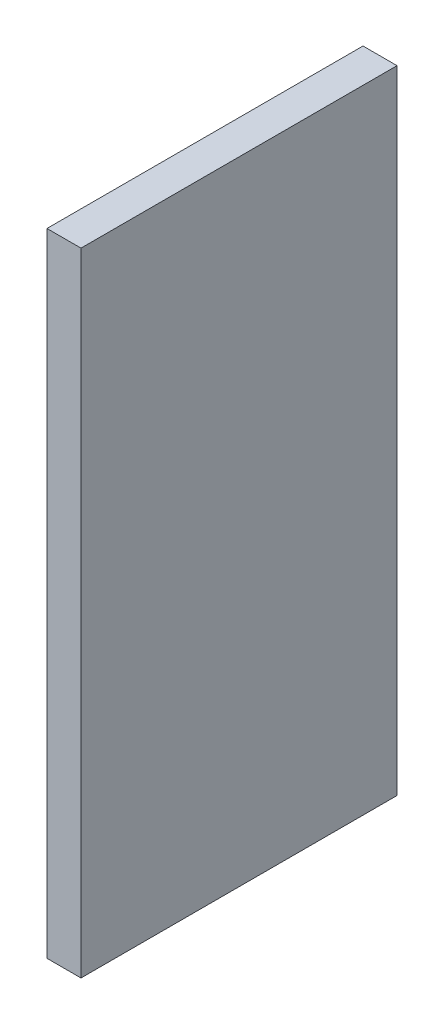
ISO-10303-21;
HEADER;
FILE_DESCRIPTION(('STEP AP214'),'2;1');
FILE_NAME('part.step','',(''),(''),'','','');
FILE_SCHEMA(('AUTOMOTIVE_DESIGN { 1 0 10303 214 1 1 1 1 }'));
ENDSEC;
DATA;
#1=APPLICATION_CONTEXT('core data for automotive mechanical design processes');
#2=APPLICATION_PROTOCOL_DEFINITION('international standard','automotive_design',2000,#1);
#3=PRODUCT_CONTEXT('',#1,'mechanical');
#4=PRODUCT('Part','Part','',(#3));
#5=PRODUCT_RELATED_PRODUCT_CATEGORY('part','',(#4));
#6=PRODUCT_DEFINITION_FORMATION('','',#4);
#7=PRODUCT_DEFINITION_CONTEXT('part definition',#1,'design');
#8=PRODUCT_DEFINITION('design','',#6,#7);
#9=PRODUCT_DEFINITION_SHAPE('','',#8);
#10=(LENGTH_UNIT() NAMED_UNIT(*) SI_UNIT(.MILLI.,.METRE.));
#11=(NAMED_UNIT(*) PLANE_ANGLE_UNIT() SI_UNIT($,.RADIAN.));
#12=(NAMED_UNIT(*) SI_UNIT($,.STERADIAN.) SOLID_ANGLE_UNIT());
#13=UNCERTAINTY_MEASURE_WITH_UNIT(LENGTH_MEASURE(1.E-05),#10,'distance_accuracy_value','');
#14=(GEOMETRIC_REPRESENTATION_CONTEXT(3) GLOBAL_UNCERTAINTY_ASSIGNED_CONTEXT((#13)) GLOBAL_UNIT_ASSIGNED_CONTEXT((#10,
#11,#12)) REPRESENTATION_CONTEXT('',''));
#15=CARTESIAN_POINT('',(0.,0.,0.));
#16=DIRECTION('',(0.,0.,1.));
#17=DIRECTION('',(1.,0.,0.));
#18=AXIS2_PLACEMENT_3D('',#15,#16,#17);
#19=CARTESIAN_POINT('',(102.034991679986,60.,-0.371420546364334));
#20=DIRECTION('',(1.,0.,0.));
#21=DIRECTION('',(0.,1.,0.));
#22=AXIS2_PLACEMENT_3D('',#19,#20,#21);
#23=PLANE('',#22);
#24=DIRECTION('',(0.,-1.,0.));
#25=VECTOR('',#24,1.);
#26=CARTESIAN_POINT('',(102.034991679986,60.,-0.371420546366252));
#27=LINE('',#26,#25);
#28=CARTESIAN_POINT('',(102.034991679986,125.,-0.371420546366252));
#29=VERTEX_POINT('',#28);
#30=CARTESIAN_POINT('',(102.034991679986,-5.,-0.371420546366252));
#31=VERTEX_POINT('',#30);
#32=EDGE_CURVE('E93',#29,#31,#27,.T.);
#33=ORIENTED_EDGE('',*,*,#32,.T.);
#34=DIRECTION('',(0.,0.,-1.));
#35=VECTOR('',#34,1.);
#36=CARTESIAN_POINT('',(102.034991679986,-5.,64.6285794536357));
#37=LINE('',#36,#35);
#38=CARTESIAN_POINT('',(102.034991679986,-5.,64.6285794536357));
#39=VERTEX_POINT('',#38);
#40=EDGE_CURVE('E87',#39,#31,#37,.T.);
#41=ORIENTED_EDGE('',*,*,#40,.F.);
#42=DIRECTION('',(0.,-1.,0.));
#43=VECTOR('',#42,1.);
#44=CARTESIAN_POINT('',(102.034991679986,125.,64.6285794536357));
#45=LINE('',#44,#43);
#46=CARTESIAN_POINT('',(102.034991679986,125.,64.6285794536357));
#47=VERTEX_POINT('',#46);
#48=EDGE_CURVE('E79',#47,#39,#45,.T.);
#49=ORIENTED_EDGE('',*,*,#48,.F.);
#50=DIRECTION('',(0.,0.,1.));
#51=VECTOR('',#50,1.);
#52=CARTESIAN_POINT('',(102.034991679986,125.,-65.3714205463643));
#53=LINE('',#52,#51);
#54=EDGE_CURVE('E11',#29,#47,#53,.T.);
#55=ORIENTED_EDGE('',*,*,#54,.F.);
#56=EDGE_LOOP('',(#33,#41,#49,#55));
#57=FACE_BOUND('',#56,.T.);
#58=ADVANCED_FACE('F17',(#57),#23,.F.);
#59=CARTESIAN_POINT('',(102.034991679986,125.,-65.3714205463643));
#60=DIRECTION('',(0.,1.,0.));
#61=DIRECTION('',(1.,0.,0.));
#62=AXIS2_PLACEMENT_3D('',#59,#60,#61);
#63=PLANE('',#62);
#64=DIRECTION('',(-1.,0.,0.));
#65=VECTOR('',#64,1.);
#66=CARTESIAN_POINT('',(103.784991679986,125.,-0.371420546366252));
#67=LINE('',#66,#65);
#68=CARTESIAN_POINT('',(109.034991679986,125.,-0.371420546366252));
#69=VERTEX_POINT('',#68);
#70=EDGE_CURVE('E107',#69,#29,#67,.T.);
#71=ORIENTED_EDGE('',*,*,#70,.T.);
#72=ORIENTED_EDGE('',*,*,#54,.T.);
#73=DIRECTION('',(1.,0.,0.));
#74=VECTOR('',#73,1.);
#75=CARTESIAN_POINT('',(102.034991679986,125.,64.6285794536357));
#76=LINE('',#75,#74);
#77=CARTESIAN_POINT('',(109.034991679986,125.,64.6285794536357));
#78=VERTEX_POINT('',#77);
#79=EDGE_CURVE('E27',#47,#78,#76,.T.);
#80=ORIENTED_EDGE('',*,*,#79,.T.);
#81=DIRECTION('',(0.,0.,1.));
#82=VECTOR('',#81,1.);
#83=CARTESIAN_POINT('',(109.034991679986,125.,-32.8714205463643));
#84=LINE('',#83,#82);
#85=EDGE_CURVE('E76',#69,#78,#84,.T.);
#86=ORIENTED_EDGE('',*,*,#85,.F.);
#87=EDGE_LOOP('',(#71,#72,#80,#86));
#88=FACE_BOUND('',#87,.T.);
#89=ADVANCED_FACE('F159',(#88),#63,.T.);
#90=CARTESIAN_POINT('',(102.034991679986,125.,64.6285794536357));
#91=DIRECTION('',(0.,0.,1.));
#92=DIRECTION('',(1.,0.,0.));
#93=AXIS2_PLACEMENT_3D('',#90,#91,#92);
#94=PLANE('',#93);
#95=ORIENTED_EDGE('',*,*,#48,.T.);
#96=DIRECTION('',(1.,0.,0.));
#97=VECTOR('',#96,1.);
#98=CARTESIAN_POINT('',(102.034991679986,-5.,64.6285794536357));
#99=LINE('',#98,#97);
#100=CARTESIAN_POINT('',(109.034991679986,-5.,64.6285794536357));
#101=VERTEX_POINT('',#100);
#102=EDGE_CURVE('E82',#39,#101,#99,.T.);
#103=ORIENTED_EDGE('',*,*,#102,.T.);
#104=DIRECTION('',(0.,-1.,0.));
#105=VECTOR('',#104,1.);
#106=CARTESIAN_POINT('',(109.034991679986,92.5,64.6285794536357));
#107=LINE('',#106,#105);
#108=EDGE_CURVE('E69',#78,#101,#107,.T.);
#109=ORIENTED_EDGE('',*,*,#108,.F.);
#110=ORIENTED_EDGE('',*,*,#79,.F.);
#111=EDGE_LOOP('',(#95,#103,#109,#110));
#112=FACE_BOUND('',#111,.T.);
#113=ADVANCED_FACE('F19',(#112),#94,.T.);
#114=CARTESIAN_POINT('',(109.034991679986,60.,-0.371420546364334));
#115=DIRECTION('',(1.,0.,0.));
#116=DIRECTION('',(0.,1.,0.));
#117=AXIS2_PLACEMENT_3D('',#114,#115,#116);
#118=PLANE('',#117);
#119=DIRECTION('',(0.,1.,0.));
#120=VECTOR('',#119,1.);
#121=CARTESIAN_POINT('',(109.034991679986,60.,-0.371420546366252));
#122=LINE('',#121,#120);
#123=CARTESIAN_POINT('',(109.034991679986,-5.,-0.371420546366252));
#124=VERTEX_POINT('',#123);
#125=EDGE_CURVE('E109',#124,#69,#122,.T.);
#126=ORIENTED_EDGE('',*,*,#125,.T.);
#127=ORIENTED_EDGE('',*,*,#85,.T.);
#128=ORIENTED_EDGE('',*,*,#108,.T.);
#129=DIRECTION('',(0.,0.,-1.));
#130=VECTOR('',#129,1.);
#131=CARTESIAN_POINT('',(109.034991679986,-5.,32.1285794536357));
#132=LINE('',#131,#130);
#133=EDGE_CURVE('E74',#101,#124,#132,.T.);
#134=ORIENTED_EDGE('',*,*,#133,.T.);
#135=EDGE_LOOP('',(#126,#127,#128,#134));
#136=FACE_BOUND('',#135,.T.);
#137=ADVANCED_FACE('F72',(#136),#118,.T.);
#138=CARTESIAN_POINT('',(102.034991679986,-5.,64.6285794536357));
#139=DIRECTION('',(0.,-1.,0.));
#140=DIRECTION('',(0.,0.,-1.));
#141=AXIS2_PLACEMENT_3D('',#138,#139,#140);
#142=PLANE('',#141);
#143=DIRECTION('',(1.,0.,0.));
#144=VECTOR('',#143,1.);
#145=CARTESIAN_POINT('',(103.784991679986,-5.,-0.371420546366252));
#146=LINE('',#145,#144);
#147=EDGE_CURVE('E21',#31,#124,#146,.T.);
#148=ORIENTED_EDGE('',*,*,#147,.T.);
#149=ORIENTED_EDGE('',*,*,#133,.F.);
#150=ORIENTED_EDGE('',*,*,#102,.F.);
#151=ORIENTED_EDGE('',*,*,#40,.T.);
#152=EDGE_LOOP('',(#148,#149,#150,#151));
#153=FACE_BOUND('',#152,.T.);
#154=ADVANCED_FACE('F89',(#153),#142,.T.);
#155=CARTESIAN_POINT('',(105.534991679986,60.0000000000009,-0.371420546366252));
#156=DIRECTION('',(0.,0.,1.));
#157=DIRECTION('',(1.,0.,0.));
#158=AXIS2_PLACEMENT_3D('',#155,#156,#157);
#159=PLANE('',#158);
#160=ORIENTED_EDGE('',*,*,#70,.F.);
#161=ORIENTED_EDGE('',*,*,#125,.F.);
#162=ORIENTED_EDGE('',*,*,#147,.F.);
#163=ORIENTED_EDGE('',*,*,#32,.F.);
#164=EDGE_LOOP('',(#160,#161,#162,#163));
#165=FACE_BOUND('',#164,.T.);
#166=ADVANCED_FACE('F176',(#165),#159,.F.);
#167=CLOSED_SHELL('',(#58,#89,#113,#137,#154,#166));
#168=MANIFOLD_SOLID_BREP('B1',#167);
#169=ADVANCED_BREP_SHAPE_REPRESENTATION('',(#18,#168),#14);
#170=SHAPE_DEFINITION_REPRESENTATION(#9,#169);
ENDSEC;
END-ISO-10303-21;
